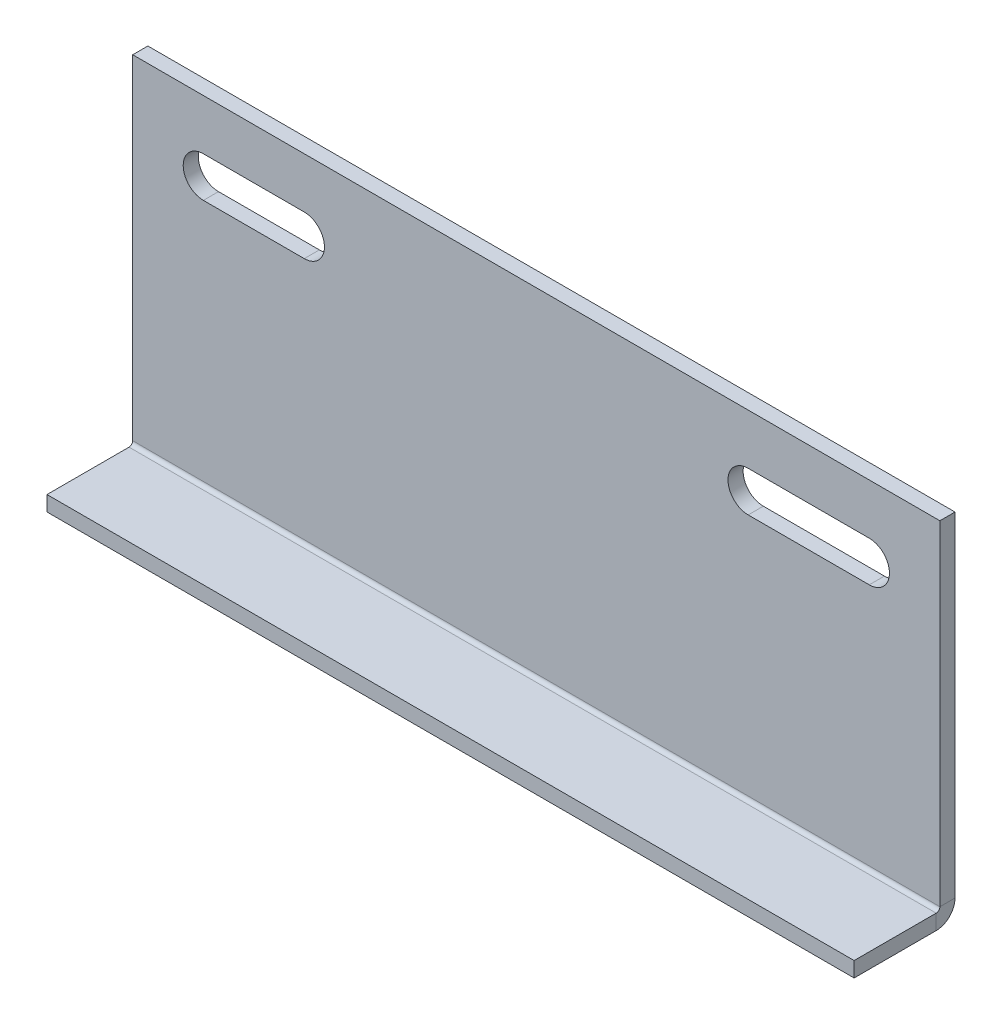
ISO-10303-21;
HEADER;
FILE_DESCRIPTION(('STEP AP214'),'2;1');
FILE_NAME('part.step','',(''),(''),'','','');
FILE_SCHEMA(('AUTOMOTIVE_DESIGN { 1 0 10303 214 1 1 1 1 }'));
ENDSEC;
DATA;
#1=APPLICATION_CONTEXT('core data for automotive mechanical design processes');
#2=APPLICATION_PROTOCOL_DEFINITION('international standard','automotive_design',2000,#1);
#3=PRODUCT_CONTEXT('',#1,'mechanical');
#4=PRODUCT('Part','Part','',(#3));
#5=PRODUCT_RELATED_PRODUCT_CATEGORY('part','',(#4));
#6=PRODUCT_DEFINITION_FORMATION('','',#4);
#7=PRODUCT_DEFINITION_CONTEXT('part definition',#1,'design');
#8=PRODUCT_DEFINITION('design','',#6,#7);
#9=PRODUCT_DEFINITION_SHAPE('','',#8);
#10=(LENGTH_UNIT() NAMED_UNIT(*) SI_UNIT(.MILLI.,.METRE.));
#11=(NAMED_UNIT(*) PLANE_ANGLE_UNIT() SI_UNIT($,.RADIAN.));
#12=(NAMED_UNIT(*) SI_UNIT($,.STERADIAN.) SOLID_ANGLE_UNIT());
#13=UNCERTAINTY_MEASURE_WITH_UNIT(LENGTH_MEASURE(1.E-05),#10,'distance_accuracy_value','');
#14=(GEOMETRIC_REPRESENTATION_CONTEXT(3) GLOBAL_UNCERTAINTY_ASSIGNED_CONTEXT((#13)) GLOBAL_UNIT_ASSIGNED_CONTEXT((#10,
#11,#12)) REPRESENTATION_CONTEXT('',''));
#15=CARTESIAN_POINT('',(0.,0.,0.));
#16=DIRECTION('',(0.,0.,1.));
#17=DIRECTION('',(1.,0.,0.));
#18=AXIS2_PLACEMENT_3D('',#15,#16,#17);
#19=CARTESIAN_POINT('',(1.32994923857861,43.1692047377327,-3.));
#20=DIRECTION('',(1.,0.,0.));
#21=DIRECTION('',(0.,1.,0.));
#22=AXIS2_PLACEMENT_3D('',#19,#20,#21);
#23=PLANE('',#22);
#24=DIRECTION('',(0.,1.,0.));
#25=VECTOR('',#24,1.);
#26=CARTESIAN_POINT('',(1.32994923857861,43.1692047377327,0.));
#27=LINE('',#26,#25);
#28=CARTESIAN_POINT('',(1.32994923857863,-23.0941952622674,0.));
#29=VERTEX_POINT('',#28);
#30=CARTESIAN_POINT('',(1.32994923857861,43.1692047377327,0.));
#31=VERTEX_POINT('',#30);
#32=EDGE_CURVE('E288',#29,#31,#27,.T.);
#33=ORIENTED_EDGE('',*,*,#32,.F.);
#34=DIRECTION('',(0.,0.,-1.));
#35=VECTOR('',#34,1.);
#36=CARTESIAN_POINT('',(1.32994923857863,-23.0941952622674,0.));
#37=LINE('',#36,#35);
#38=CARTESIAN_POINT('',(1.32994923857863,-23.0941952622674,-3.00000000000001));
#39=VERTEX_POINT('',#38);
#40=EDGE_CURVE('E222',#29,#39,#37,.T.);
#41=ORIENTED_EDGE('',*,*,#40,.T.);
#42=DIRECTION('',(0.,1.,0.));
#43=VECTOR('',#42,1.);
#44=CARTESIAN_POINT('',(1.32994923857861,43.1692047377327,-3.));
#45=LINE('',#44,#43);
#46=CARTESIAN_POINT('',(1.32994923857861,43.1692047377327,-3.));
#47=VERTEX_POINT('',#46);
#48=EDGE_CURVE('E295',#39,#47,#45,.T.);
#49=ORIENTED_EDGE('',*,*,#48,.T.);
#50=DIRECTION('',(0.,0.,1.));
#51=VECTOR('',#50,1.);
#52=CARTESIAN_POINT('',(1.32994923857861,43.1692047377327,-3.));
#53=LINE('',#52,#51);
#54=EDGE_CURVE('E61',#47,#31,#53,.T.);
#55=ORIENTED_EDGE('',*,*,#54,.T.);
#56=EDGE_LOOP('',(#33,#41,#49,#55));
#57=FACE_BOUND('',#56,.T.);
#58=ADVANCED_FACE('F58',(#57),#23,.T.);
#59=CARTESIAN_POINT('',(0.,0.,-3.));
#60=DIRECTION('',(0.,0.,-1.));
#61=DIRECTION('',(-1.,0.,0.));
#62=AXIS2_PLACEMENT_3D('',#59,#60,#61);
#63=PLANE('',#62);
#64=CARTESIAN_POINT('',(-12.6700507614214,29.1692047377327,-3.));
#65=DIRECTION('',(0.,0.,1.));
#66=DIRECTION('',(1.,0.,0.));
#67=AXIS2_PLACEMENT_3D('',#64,#65,#66);
#68=CIRCLE('',#67,4.);
#69=CARTESIAN_POINT('',(-12.6700507614214,25.1692047377327,-3.));
#70=VERTEX_POINT('',#69);
#71=CARTESIAN_POINT('',(-12.6700507614214,33.1692047377327,-3.));
#72=VERTEX_POINT('',#71);
#73=EDGE_CURVE('E233',#70,#72,#68,.T.);
#74=ORIENTED_EDGE('',*,*,#73,.T.);
#75=DIRECTION('',(-1.,0.,0.));
#76=VECTOR('',#75,1.);
#77=CARTESIAN_POINT('',(-12.6700507614214,33.1692047377327,-3.));
#78=LINE('',#77,#76);
#79=CARTESIAN_POINT('',(-36.6700507614214,33.1692047377327,-3.));
#80=VERTEX_POINT('',#79);
#81=EDGE_CURVE('E236',#72,#80,#78,.T.);
#82=ORIENTED_EDGE('',*,*,#81,.T.);
#83=CARTESIAN_POINT('',(-36.6700507614214,29.1692047377327,-3.));
#84=DIRECTION('',(0.,0.,1.));
#85=DIRECTION('',(1.,0.,0.));
#86=AXIS2_PLACEMENT_3D('',#83,#84,#85);
#87=CIRCLE('',#86,4.00000000000001);
#88=CARTESIAN_POINT('',(-36.6700507614214,25.1692047377327,-3.));
#89=VERTEX_POINT('',#88);
#90=EDGE_CURVE('E80',#80,#89,#87,.T.);
#91=ORIENTED_EDGE('',*,*,#90,.T.);
#92=DIRECTION('',(1.,0.,0.));
#93=VECTOR('',#92,1.);
#94=CARTESIAN_POINT('',(-12.6700507614214,25.1692047377327,-3.));
#95=LINE('',#94,#93);
#96=EDGE_CURVE('E241',#89,#70,#95,.T.);
#97=ORIENTED_EDGE('',*,*,#96,.T.);
#98=EDGE_LOOP('',(#74,#82,#91,#97));
#99=FACE_BOUND('',#98,.T.);
#100=CARTESIAN_POINT('',(-144.670050761421,29.1692047377327,-3.));
#101=DIRECTION('',(0.,0.,1.));
#102=DIRECTION('',(1.,0.,0.));
#103=AXIS2_PLACEMENT_3D('',#100,#101,#102);
#104=CIRCLE('',#103,4.);
#105=CARTESIAN_POINT('',(-144.670050761421,33.1692047377327,-3.));
#106=VERTEX_POINT('',#105);
#107=CARTESIAN_POINT('',(-144.670050761421,25.1692047377327,-3.));
#108=VERTEX_POINT('',#107);
#109=EDGE_CURVE('E263',#106,#108,#104,.T.);
#110=ORIENTED_EDGE('',*,*,#109,.T.);
#111=DIRECTION('',(1.,0.,0.));
#112=VECTOR('',#111,1.);
#113=CARTESIAN_POINT('',(-144.670050761421,25.1692047377327,-3.));
#114=LINE('',#113,#112);
#115=CARTESIAN_POINT('',(-124.670050761421,25.1692047377327,-3.));
#116=VERTEX_POINT('',#115);
#117=EDGE_CURVE('E266',#108,#116,#114,.T.);
#118=ORIENTED_EDGE('',*,*,#117,.T.);
#119=CARTESIAN_POINT('',(-124.670050761421,29.1692047377327,-3.));
#120=DIRECTION('',(0.,0.,1.));
#121=DIRECTION('',(1.,0.,0.));
#122=AXIS2_PLACEMENT_3D('',#119,#120,#121);
#123=CIRCLE('',#122,4.);
#124=CARTESIAN_POINT('',(-124.670050761421,33.1692047377327,-3.));
#125=VERTEX_POINT('',#124);
#126=EDGE_CURVE('E270',#116,#125,#123,.T.);
#127=ORIENTED_EDGE('',*,*,#126,.T.);
#128=DIRECTION('',(-1.,0.,0.));
#129=VECTOR('',#128,1.);
#130=CARTESIAN_POINT('',(-144.670050761421,33.1692047377327,-3.));
#131=LINE('',#130,#129);
#132=EDGE_CURVE('E273',#125,#106,#131,.T.);
#133=ORIENTED_EDGE('',*,*,#132,.T.);
#134=EDGE_LOOP('',(#110,#118,#127,#133));
#135=FACE_BOUND('',#134,.T.);
#136=ORIENTED_EDGE('',*,*,#48,.F.);
#137=DIRECTION('',(1.,0.,0.));
#138=VECTOR('',#137,1.);
#139=CARTESIAN_POINT('',(1.32994923857863,-23.0941952622674,-3.00000000000001));
#140=LINE('',#139,#138);
#141=CARTESIAN_POINT('',(-158.670050761421,-23.0941952622673,-3.));
#142=VERTEX_POINT('',#141);
#143=EDGE_CURVE('E173',#39,#142,#140,.F.);
#144=ORIENTED_EDGE('',*,*,#143,.T.);
#145=DIRECTION('',(0.,-1.,0.));
#146=VECTOR('',#145,1.);
#147=CARTESIAN_POINT('',(-158.670050761421,43.1692047377326,-3.));
#148=LINE('',#147,#146);
#149=CARTESIAN_POINT('',(-158.670050761421,43.1692047377326,-3.));
#150=VERTEX_POINT('',#149);
#151=EDGE_CURVE('E301',#150,#142,#148,.T.);
#152=ORIENTED_EDGE('',*,*,#151,.F.);
#153=DIRECTION('',(-1.,0.,0.));
#154=VECTOR('',#153,1.);
#155=CARTESIAN_POINT('',(1.32994923857861,43.1692047377327,-3.));
#156=LINE('',#155,#154);
#157=EDGE_CURVE('E297',#47,#150,#156,.T.);
#158=ORIENTED_EDGE('',*,*,#157,.F.);
#159=EDGE_LOOP('',(#136,#144,#152,#158));
#160=FACE_BOUND('',#159,.T.);
#161=ADVANCED_FACE('F324',(#99,#135,#160),#63,.T.);
#162=CARTESIAN_POINT('',(0.,0.,0.));
#163=DIRECTION('',(0.,0.,-1.));
#164=DIRECTION('',(-1.,0.,0.));
#165=AXIS2_PLACEMENT_3D('',#162,#163,#164);
#166=PLANE('',#165);
#167=DIRECTION('',(1.,0.,0.));
#168=VECTOR('',#167,1.);
#169=CARTESIAN_POINT('',(-144.670050761421,25.1692047377327,0.));
#170=LINE('',#169,#168);
#171=CARTESIAN_POINT('',(-144.670050761421,25.1692047377327,0.));
#172=VERTEX_POINT('',#171);
#173=CARTESIAN_POINT('',(-124.670050761421,25.1692047377327,0.));
#174=VERTEX_POINT('',#173);
#175=EDGE_CURVE('E278',#172,#174,#170,.T.);
#176=ORIENTED_EDGE('',*,*,#175,.F.);
#177=CARTESIAN_POINT('',(-144.670050761421,29.1692047377327,0.));
#178=DIRECTION('',(0.,0.,1.));
#179=DIRECTION('',(1.,0.,0.));
#180=AXIS2_PLACEMENT_3D('',#177,#178,#179);
#181=CIRCLE('',#180,4.);
#182=CARTESIAN_POINT('',(-144.670050761421,33.1692047377327,0.));
#183=VERTEX_POINT('',#182);
#184=EDGE_CURVE('E256',#183,#172,#181,.T.);
#185=ORIENTED_EDGE('',*,*,#184,.F.);
#186=DIRECTION('',(-1.,0.,0.));
#187=VECTOR('',#186,1.);
#188=CARTESIAN_POINT('',(-144.670050761421,33.1692047377327,0.));
#189=LINE('',#188,#187);
#190=CARTESIAN_POINT('',(-124.670050761421,33.1692047377327,0.));
#191=VERTEX_POINT('',#190);
#192=EDGE_CURVE('E267',#191,#183,#189,.T.);
#193=ORIENTED_EDGE('',*,*,#192,.F.);
#194=CARTESIAN_POINT('',(-124.670050761421,29.1692047377327,0.));
#195=DIRECTION('',(0.,0.,1.));
#196=DIRECTION('',(1.,0.,0.));
#197=AXIS2_PLACEMENT_3D('',#194,#195,#196);
#198=CIRCLE('',#197,4.);
#199=EDGE_CURVE('E281',#174,#191,#198,.T.);
#200=ORIENTED_EDGE('',*,*,#199,.F.);
#201=EDGE_LOOP('',(#176,#185,#193,#200));
#202=FACE_BOUND('',#201,.T.);
#203=DIRECTION('',(-1.,0.,0.));
#204=VECTOR('',#203,1.);
#205=CARTESIAN_POINT('',(-12.6700507614214,33.1692047377327,0.));
#206=LINE('',#205,#204);
#207=CARTESIAN_POINT('',(-12.6700507614214,33.1692047377327,0.));
#208=VERTEX_POINT('',#207);
#209=CARTESIAN_POINT('',(-36.6700507614214,33.1692047377327,0.));
#210=VERTEX_POINT('',#209);
#211=EDGE_CURVE('E246',#208,#210,#206,.T.);
#212=ORIENTED_EDGE('',*,*,#211,.F.);
#213=CARTESIAN_POINT('',(-12.6700507614214,29.1692047377327,0.));
#214=DIRECTION('',(0.,0.,1.));
#215=DIRECTION('',(1.,0.,0.));
#216=AXIS2_PLACEMENT_3D('',#213,#214,#215);
#217=CIRCLE('',#216,4.);
#218=CARTESIAN_POINT('',(-12.6700507614214,25.1692047377327,0.));
#219=VERTEX_POINT('',#218);
#220=EDGE_CURVE('E231',#219,#208,#217,.T.);
#221=ORIENTED_EDGE('',*,*,#220,.F.);
#222=DIRECTION('',(1.,0.,0.));
#223=VECTOR('',#222,1.);
#224=CARTESIAN_POINT('',(-12.6700507614214,25.1692047377327,0.));
#225=LINE('',#224,#223);
#226=CARTESIAN_POINT('',(-36.6700507614214,25.1692047377327,0.));
#227=VERTEX_POINT('',#226);
#228=EDGE_CURVE('E237',#227,#219,#225,.T.);
#229=ORIENTED_EDGE('',*,*,#228,.F.);
#230=CARTESIAN_POINT('',(-36.6700507614214,29.1692047377327,0.));
#231=DIRECTION('',(0.,0.,1.));
#232=DIRECTION('',(1.,0.,0.));
#233=AXIS2_PLACEMENT_3D('',#230,#231,#232);
#234=CIRCLE('',#233,4.00000000000001);
#235=EDGE_CURVE('E249',#210,#227,#234,.T.);
#236=ORIENTED_EDGE('',*,*,#235,.F.);
#237=EDGE_LOOP('',(#212,#221,#229,#236));
#238=FACE_BOUND('',#237,.T.);
#239=DIRECTION('',(1.,0.,0.));
#240=VECTOR('',#239,1.);
#241=CARTESIAN_POINT('',(1.32994923857863,-23.0941952622674,0.));
#242=LINE('',#241,#240);
#243=CARTESIAN_POINT('',(-158.670050761421,-23.0941952622674,0.));
#244=VERTEX_POINT('',#243);
#245=EDGE_CURVE('E226',#29,#244,#242,.F.);
#246=ORIENTED_EDGE('',*,*,#245,.F.);
#247=ORIENTED_EDGE('',*,*,#32,.T.);
#248=DIRECTION('',(-1.,0.,0.));
#249=VECTOR('',#248,1.);
#250=CARTESIAN_POINT('',(1.32994923857861,43.1692047377327,0.));
#251=LINE('',#250,#249);
#252=CARTESIAN_POINT('',(-158.670050761421,43.1692047377326,0.));
#253=VERTEX_POINT('',#252);
#254=EDGE_CURVE('E305',#31,#253,#251,.T.);
#255=ORIENTED_EDGE('',*,*,#254,.T.);
#256=DIRECTION('',(0.,-1.,0.));
#257=VECTOR('',#256,1.);
#258=CARTESIAN_POINT('',(-158.670050761421,43.1692047377326,0.));
#259=LINE('',#258,#257);
#260=EDGE_CURVE('E298',#253,#244,#259,.T.);
#261=ORIENTED_EDGE('',*,*,#260,.T.);
#262=EDGE_LOOP('',(#246,#247,#255,#261));
#263=FACE_BOUND('',#262,.T.);
#264=ADVANCED_FACE('F313',(#202,#238,#263),#166,.F.);
#265=CARTESIAN_POINT('',(-158.670050761421,43.1692047377326,-3.));
#266=DIRECTION('',(-1.,0.,0.));
#267=DIRECTION('',(0.,0.,1.));
#268=AXIS2_PLACEMENT_3D('',#265,#266,#267);
#269=PLANE('',#268);
#270=DIRECTION('',(0.,0.,-1.));
#271=VECTOR('',#270,1.);
#272=CARTESIAN_POINT('',(-158.670050761421,-23.0941952622674,0.));
#273=LINE('',#272,#271);
#274=EDGE_CURVE('E229',#244,#142,#273,.T.);
#275=ORIENTED_EDGE('',*,*,#274,.F.);
#276=ORIENTED_EDGE('',*,*,#260,.F.);
#277=DIRECTION('',(0.,0.,1.));
#278=VECTOR('',#277,1.);
#279=CARTESIAN_POINT('',(-158.670050761421,43.1692047377326,-3.));
#280=LINE('',#279,#278);
#281=EDGE_CURVE('E13',#150,#253,#280,.T.);
#282=ORIENTED_EDGE('',*,*,#281,.F.);
#283=ORIENTED_EDGE('',*,*,#151,.T.);
#284=EDGE_LOOP('',(#275,#276,#282,#283));
#285=FACE_BOUND('',#284,.T.);
#286=ADVANCED_FACE('F317',(#285),#269,.T.);
#287=CARTESIAN_POINT('',(1.32994923857861,43.1692047377327,-3.));
#288=DIRECTION('',(0.,1.,0.));
#289=DIRECTION('',(-1.,0.,0.));
#290=AXIS2_PLACEMENT_3D('',#287,#288,#289);
#291=PLANE('',#290);
#292=ORIENTED_EDGE('',*,*,#254,.F.);
#293=ORIENTED_EDGE('',*,*,#54,.F.);
#294=ORIENTED_EDGE('',*,*,#157,.T.);
#295=ORIENTED_EDGE('',*,*,#281,.T.);
#296=EDGE_LOOP('',(#292,#293,#294,#295));
#297=FACE_BOUND('',#296,.T.);
#298=ADVANCED_FACE('F330',(#297),#291,.T.);
#299=CARTESIAN_POINT('',(-144.670050761421,29.1692047377327,-3.));
#300=DIRECTION('',(0.,0.,1.));
#301=DIRECTION('',(1.,0.,0.));
#302=AXIS2_PLACEMENT_3D('',#299,#300,#301);
#303=CYLINDRICAL_SURFACE('',#302,4.);
#304=ORIENTED_EDGE('',*,*,#184,.T.);
#305=DIRECTION('',(0.,0.,1.));
#306=VECTOR('',#305,1.);
#307=CARTESIAN_POINT('',(-144.670050761421,25.1692047377327,-3.));
#308=LINE('',#307,#306);
#309=EDGE_CURVE('E276',#108,#172,#308,.T.);
#310=ORIENTED_EDGE('',*,*,#309,.F.);
#311=ORIENTED_EDGE('',*,*,#109,.F.);
#312=DIRECTION('',(0.,0.,1.));
#313=VECTOR('',#312,1.);
#314=CARTESIAN_POINT('',(-144.670050761421,33.1692047377327,-3.));
#315=LINE('',#314,#313);
#316=EDGE_CURVE('E286',#106,#183,#315,.T.);
#317=ORIENTED_EDGE('',*,*,#316,.T.);
#318=EDGE_LOOP('',(#304,#310,#311,#317));
#319=FACE_BOUND('',#318,.T.);
#320=ADVANCED_FACE('F332',(#319),#303,.F.);
#321=CARTESIAN_POINT('',(-144.670050761421,33.1692047377327,-3.));
#322=DIRECTION('',(0.,1.,0.));
#323=DIRECTION('',(-1.,0.,0.));
#324=AXIS2_PLACEMENT_3D('',#321,#322,#323);
#325=PLANE('',#324);
#326=ORIENTED_EDGE('',*,*,#192,.T.);
#327=ORIENTED_EDGE('',*,*,#316,.F.);
#328=ORIENTED_EDGE('',*,*,#132,.F.);
#329=DIRECTION('',(0.,0.,1.));
#330=VECTOR('',#329,1.);
#331=CARTESIAN_POINT('',(-124.670050761421,33.1692047377327,-3.));
#332=LINE('',#331,#330);
#333=EDGE_CURVE('E289',#125,#191,#332,.T.);
#334=ORIENTED_EDGE('',*,*,#333,.T.);
#335=EDGE_LOOP('',(#326,#327,#328,#334));
#336=FACE_BOUND('',#335,.T.);
#337=ADVANCED_FACE('F337',(#336),#325,.F.);
#338=CARTESIAN_POINT('',(-124.670050761421,29.1692047377327,-3.));
#339=DIRECTION('',(0.,0.,1.));
#340=DIRECTION('',(1.,0.,0.));
#341=AXIS2_PLACEMENT_3D('',#338,#339,#340);
#342=CYLINDRICAL_SURFACE('',#341,4.);
#343=ORIENTED_EDGE('',*,*,#199,.T.);
#344=ORIENTED_EDGE('',*,*,#333,.F.);
#345=ORIENTED_EDGE('',*,*,#126,.F.);
#346=DIRECTION('',(0.,0.,1.));
#347=VECTOR('',#346,1.);
#348=CARTESIAN_POINT('',(-124.670050761421,25.1692047377327,-3.));
#349=LINE('',#348,#347);
#350=EDGE_CURVE('E291',#116,#174,#349,.T.);
#351=ORIENTED_EDGE('',*,*,#350,.T.);
#352=EDGE_LOOP('',(#343,#344,#345,#351));
#353=FACE_BOUND('',#352,.T.);
#354=ADVANCED_FACE('F358',(#353),#342,.F.);
#355=CARTESIAN_POINT('',(-144.670050761421,25.1692047377327,-3.));
#356=DIRECTION('',(0.,-1.,0.));
#357=DIRECTION('',(0.,0.,-1.));
#358=AXIS2_PLACEMENT_3D('',#355,#356,#357);
#359=PLANE('',#358);
#360=ORIENTED_EDGE('',*,*,#175,.T.);
#361=ORIENTED_EDGE('',*,*,#350,.F.);
#362=ORIENTED_EDGE('',*,*,#117,.F.);
#363=ORIENTED_EDGE('',*,*,#309,.T.);
#364=EDGE_LOOP('',(#360,#361,#362,#363));
#365=FACE_BOUND('',#364,.T.);
#366=ADVANCED_FACE('F354',(#365),#359,.F.);
#367=CARTESIAN_POINT('',(-12.6700507614214,29.1692047377327,-3.));
#368=DIRECTION('',(0.,0.,1.));
#369=DIRECTION('',(1.,0.,0.));
#370=AXIS2_PLACEMENT_3D('',#367,#368,#369);
#371=CYLINDRICAL_SURFACE('',#370,4.);
#372=ORIENTED_EDGE('',*,*,#220,.T.);
#373=DIRECTION('',(0.,0.,1.));
#374=VECTOR('',#373,1.);
#375=CARTESIAN_POINT('',(-12.6700507614214,33.1692047377327,-3.));
#376=LINE('',#375,#374);
#377=EDGE_CURVE('E244',#72,#208,#376,.T.);
#378=ORIENTED_EDGE('',*,*,#377,.F.);
#379=ORIENTED_EDGE('',*,*,#73,.F.);
#380=DIRECTION('',(0.,0.,1.));
#381=VECTOR('',#380,1.);
#382=CARTESIAN_POINT('',(-12.6700507614214,25.1692047377327,-3.));
#383=LINE('',#382,#381);
#384=EDGE_CURVE('E254',#70,#219,#383,.T.);
#385=ORIENTED_EDGE('',*,*,#384,.T.);
#386=EDGE_LOOP('',(#372,#378,#379,#385));
#387=FACE_BOUND('',#386,.T.);
#388=ADVANCED_FACE('F357',(#387),#371,.F.);
#389=CARTESIAN_POINT('',(-12.6700507614214,25.1692047377327,-3.));
#390=DIRECTION('',(0.,-1.,0.));
#391=DIRECTION('',(1.,0.,0.));
#392=AXIS2_PLACEMENT_3D('',#389,#390,#391);
#393=PLANE('',#392);
#394=ORIENTED_EDGE('',*,*,#228,.T.);
#395=ORIENTED_EDGE('',*,*,#384,.F.);
#396=ORIENTED_EDGE('',*,*,#96,.F.);
#397=DIRECTION('',(0.,0.,1.));
#398=VECTOR('',#397,1.);
#399=CARTESIAN_POINT('',(-36.6700507614214,25.1692047377327,-3.));
#400=LINE('',#399,#398);
#401=EDGE_CURVE('E257',#89,#227,#400,.T.);
#402=ORIENTED_EDGE('',*,*,#401,.T.);
#403=EDGE_LOOP('',(#394,#395,#396,#402));
#404=FACE_BOUND('',#403,.T.);
#405=ADVANCED_FACE('F368',(#404),#393,.F.);
#406=CARTESIAN_POINT('',(-36.6700507614214,29.1692047377327,-3.));
#407=DIRECTION('',(0.,0.,1.));
#408=DIRECTION('',(1.,0.,0.));
#409=AXIS2_PLACEMENT_3D('',#406,#407,#408);
#410=CYLINDRICAL_SURFACE('',#409,4.00000000000001);
#411=ORIENTED_EDGE('',*,*,#235,.T.);
#412=ORIENTED_EDGE('',*,*,#401,.F.);
#413=ORIENTED_EDGE('',*,*,#90,.F.);
#414=DIRECTION('',(0.,0.,1.));
#415=VECTOR('',#414,1.);
#416=CARTESIAN_POINT('',(-36.6700507614214,33.1692047377327,-3.));
#417=LINE('',#416,#415);
#418=EDGE_CURVE('E259',#80,#210,#417,.T.);
#419=ORIENTED_EDGE('',*,*,#418,.T.);
#420=EDGE_LOOP('',(#411,#412,#413,#419));
#421=FACE_BOUND('',#420,.T.);
#422=ADVANCED_FACE('F373',(#421),#410,.F.);
#423=CARTESIAN_POINT('',(-12.6700507614214,33.1692047377327,-3.));
#424=DIRECTION('',(0.,1.,0.));
#425=DIRECTION('',(-1.,0.,0.));
#426=AXIS2_PLACEMENT_3D('',#423,#424,#425);
#427=PLANE('',#426);
#428=ORIENTED_EDGE('',*,*,#211,.T.);
#429=ORIENTED_EDGE('',*,*,#418,.F.);
#430=ORIENTED_EDGE('',*,*,#81,.F.);
#431=ORIENTED_EDGE('',*,*,#377,.T.);
#432=EDGE_LOOP('',(#428,#429,#430,#431));
#433=FACE_BOUND('',#432,.T.);
#434=ADVANCED_FACE('F370',(#433),#427,.F.);
#435=CARTESIAN_POINT('',(-158.670050761421,-23.0941952622674,0.736600000000002));
#436=DIRECTION('',(-1.,0.,0.));
#437=DIRECTION('',(0.,0.,1.));
#438=AXIS2_PLACEMENT_3D('',#435,#436,#437);
#439=PLANE('',#438);
#440=DIRECTION('',(0.,-1.,0.));
#441=VECTOR('',#440,1.);
#442=CARTESIAN_POINT('',(-158.670050761421,-26.8307952622674,0.736599999999987));
#443=LINE('',#442,#441);
#444=CARTESIAN_POINT('',(-158.670050761421,-23.8307952622674,0.736599999999999));
#445=VERTEX_POINT('',#444);
#446=CARTESIAN_POINT('',(-158.670050761421,-26.8307952622674,0.736599999999989));
#447=VERTEX_POINT('',#446);
#448=EDGE_CURVE('E218',#445,#447,#443,.T.);
#449=ORIENTED_EDGE('',*,*,#448,.F.);
#450=CARTESIAN_POINT('',(-158.670050761421,-23.0941952622674,0.736600000000002));
#451=DIRECTION('',(1.,0.,0.));
#452=DIRECTION('',(0.,0.,-1.));
#453=AXIS2_PLACEMENT_3D('',#450,#451,#452);
#454=CIRCLE('',#453,0.736600000000004);
#455=EDGE_CURVE('E176',#244,#445,#454,.F.);
#456=ORIENTED_EDGE('',*,*,#455,.F.);
#457=ORIENTED_EDGE('',*,*,#274,.T.);
#458=CARTESIAN_POINT('',(-158.670050761421,-23.0941952622674,0.736600000000002));
#459=DIRECTION('',(1.,0.,0.));
#460=DIRECTION('',(0.,0.,-1.));
#461=AXIS2_PLACEMENT_3D('',#458,#459,#460);
#462=CIRCLE('',#461,3.7366);
#463=EDGE_CURVE('E72',#142,#447,#462,.F.);
#464=ORIENTED_EDGE('',*,*,#463,.T.);
#465=EDGE_LOOP('',(#449,#456,#457,#464));
#466=FACE_BOUND('',#465,.T.);
#467=ADVANCED_FACE('F321',(#466),#439,.T.);
#468=CARTESIAN_POINT('',(1.32994923857863,-23.0941952622674,0.73659999999999));
#469=DIRECTION('',(-1.,0.,0.));
#470=DIRECTION('',(0.,0.,1.));
#471=AXIS2_PLACEMENT_3D('',#468,#469,#470);
#472=PLANE('',#471);
#473=CARTESIAN_POINT('',(1.32994923857863,-23.0941952622674,0.73659999999999));
#474=DIRECTION('',(1.,0.,0.));
#475=DIRECTION('',(0.,0.,-1.));
#476=AXIS2_PLACEMENT_3D('',#473,#474,#475);
#477=CIRCLE('',#476,0.736600000000004);
#478=CARTESIAN_POINT('',(1.32994923857863,-23.8307952622674,0.736599999999988));
#479=VERTEX_POINT('',#478);
#480=EDGE_CURVE('E183',#479,#29,#477,.T.);
#481=ORIENTED_EDGE('',*,*,#480,.F.);
#482=DIRECTION('',(0.,-1.,0.));
#483=VECTOR('',#482,1.);
#484=CARTESIAN_POINT('',(1.32994923857863,-23.8307952622674,0.73659999999999));
#485=LINE('',#484,#483);
#486=CARTESIAN_POINT('',(1.32994923857863,-26.8307952622674,0.736599999999979));
#487=VERTEX_POINT('',#486);
#488=EDGE_CURVE('E180',#479,#487,#485,.T.);
#489=ORIENTED_EDGE('',*,*,#488,.T.);
#490=CARTESIAN_POINT('',(1.32994923857863,-23.0941952622674,0.73659999999999));
#491=DIRECTION('',(1.,0.,0.));
#492=DIRECTION('',(0.,0.,-1.));
#493=AXIS2_PLACEMENT_3D('',#490,#491,#492);
#494=CIRCLE('',#493,3.7366);
#495=EDGE_CURVE('E167',#487,#39,#494,.T.);
#496=ORIENTED_EDGE('',*,*,#495,.T.);
#497=ORIENTED_EDGE('',*,*,#40,.F.);
#498=EDGE_LOOP('',(#481,#489,#496,#497));
#499=FACE_BOUND('',#498,.T.);
#500=ADVANCED_FACE('F181',(#499),#472,.F.);
#501=CARTESIAN_POINT('',(1.32994923857863,-23.0941952622674,0.73659999999999));
#502=DIRECTION('',(1.,0.,0.));
#503=DIRECTION('',(0.,-1.,0.));
#504=AXIS2_PLACEMENT_3D('',#501,#502,#503);
#505=CYLINDRICAL_SURFACE('',#504,3.7366);
#506=ORIENTED_EDGE('',*,*,#143,.F.);
#507=ORIENTED_EDGE('',*,*,#495,.F.);
#508=DIRECTION('',(1.,0.,0.));
#509=VECTOR('',#508,1.);
#510=CARTESIAN_POINT('',(0.,-26.8307952622674,0.73659999999998));
#511=LINE('',#510,#509);
#512=EDGE_CURVE('E171',#447,#487,#511,.T.);
#513=ORIENTED_EDGE('',*,*,#512,.F.);
#514=ORIENTED_EDGE('',*,*,#463,.F.);
#515=EDGE_LOOP('',(#506,#507,#513,#514));
#516=FACE_BOUND('',#515,.T.);
#517=ADVANCED_FACE('F169',(#516),#505,.T.);
#518=CARTESIAN_POINT('',(1.32994923857863,-23.0941952622674,0.73659999999999));
#519=DIRECTION('',(1.,0.,0.));
#520=DIRECTION('',(0.,-1.,0.));
#521=AXIS2_PLACEMENT_3D('',#518,#519,#520);
#522=CYLINDRICAL_SURFACE('',#521,0.736600000000004);
#523=ORIENTED_EDGE('',*,*,#245,.T.);
#524=ORIENTED_EDGE('',*,*,#455,.T.);
#525=DIRECTION('',(-1.,0.,0.));
#526=VECTOR('',#525,1.);
#527=CARTESIAN_POINT('',(-158.670050761421,-23.8307952622674,0.736599999999997));
#528=LINE('',#527,#526);
#529=EDGE_CURVE('E188',#445,#479,#528,.F.);
#530=ORIENTED_EDGE('',*,*,#529,.T.);
#531=ORIENTED_EDGE('',*,*,#480,.T.);
#532=EDGE_LOOP('',(#523,#524,#530,#531));
#533=FACE_BOUND('',#532,.T.);
#534=ADVANCED_FACE('F384',(#533),#522,.F.);
#535=CARTESIAN_POINT('',(1.32994923857863,-26.8307952622674,0.));
#536=DIRECTION('',(1.,0.,0.));
#537=DIRECTION('',(0.,1.,0.));
#538=AXIS2_PLACEMENT_3D('',#535,#536,#537);
#539=PLANE('',#538);
#540=DIRECTION('',(0.,0.,-1.));
#541=VECTOR('',#540,1.);
#542=CARTESIAN_POINT('',(1.32994923857863,-26.8307952622674,0.));
#543=LINE('',#542,#541);
#544=CARTESIAN_POINT('',(1.32994923857863,-26.8307952622674,17.));
#545=VERTEX_POINT('',#544);
#546=EDGE_CURVE('E195',#545,#487,#543,.T.);
#547=ORIENTED_EDGE('',*,*,#546,.T.);
#548=ORIENTED_EDGE('',*,*,#488,.F.);
#549=DIRECTION('',(0.,0.,1.));
#550=VECTOR('',#549,1.);
#551=CARTESIAN_POINT('',(1.32994923857863,-23.8307952622674,0.));
#552=LINE('',#551,#550);
#553=CARTESIAN_POINT('',(1.32994923857863,-23.8307952622674,17.));
#554=VERTEX_POINT('',#553);
#555=EDGE_CURVE('E211',#554,#479,#552,.F.);
#556=ORIENTED_EDGE('',*,*,#555,.F.);
#557=DIRECTION('',(0.,1.,0.));
#558=VECTOR('',#557,1.);
#559=CARTESIAN_POINT('',(1.32994923857863,-26.8307952622674,17.));
#560=LINE('',#559,#558);
#561=EDGE_CURVE('E200',#545,#554,#560,.T.);
#562=ORIENTED_EDGE('',*,*,#561,.F.);
#563=EDGE_LOOP('',(#547,#548,#556,#562));
#564=FACE_BOUND('',#563,.T.);
#565=ADVANCED_FACE('F199',(#564),#539,.T.);
#566=CARTESIAN_POINT('',(-158.670050761421,-26.8307952622674,17.));
#567=DIRECTION('',(-1.,0.,0.));
#568=DIRECTION('',(0.,-1.,0.));
#569=AXIS2_PLACEMENT_3D('',#566,#567,#568);
#570=PLANE('',#569);
#571=DIRECTION('',(0.,0.,-1.));
#572=VECTOR('',#571,1.);
#573=CARTESIAN_POINT('',(-158.670050761421,-23.8307952622674,0.));
#574=LINE('',#573,#572);
#575=CARTESIAN_POINT('',(-158.670050761421,-23.8307952622674,17.));
#576=VERTEX_POINT('',#575);
#577=EDGE_CURVE('E197',#445,#576,#574,.F.);
#578=ORIENTED_EDGE('',*,*,#577,.F.);
#579=ORIENTED_EDGE('',*,*,#448,.T.);
#580=DIRECTION('',(0.,0.,1.));
#581=VECTOR('',#580,1.);
#582=CARTESIAN_POINT('',(-158.670050761421,-26.8307952622674,17.));
#583=LINE('',#582,#581);
#584=CARTESIAN_POINT('',(-158.670050761421,-26.8307952622674,17.));
#585=VERTEX_POINT('',#584);
#586=EDGE_CURVE('E196',#447,#585,#583,.T.);
#587=ORIENTED_EDGE('',*,*,#586,.T.);
#588=DIRECTION('',(0.,1.,0.));
#589=VECTOR('',#588,1.);
#590=CARTESIAN_POINT('',(-158.670050761421,-26.8307952622674,17.));
#591=LINE('',#590,#589);
#592=EDGE_CURVE('E202',#585,#576,#591,.T.);
#593=ORIENTED_EDGE('',*,*,#592,.T.);
#594=EDGE_LOOP('',(#578,#579,#587,#593));
#595=FACE_BOUND('',#594,.T.);
#596=ADVANCED_FACE('F390',(#595),#570,.T.);
#597=CARTESIAN_POINT('',(0.,-26.8307952622674,-1.03562464857694E-13));
#598=DIRECTION('',(0.,-1.,0.));
#599=DIRECTION('',(0.,0.,-1.));
#600=AXIS2_PLACEMENT_3D('',#597,#598,#599);
#601=PLANE('',#600);
#602=ORIENTED_EDGE('',*,*,#586,.F.);
#603=ORIENTED_EDGE('',*,*,#512,.T.);
#604=ORIENTED_EDGE('',*,*,#546,.F.);
#605=DIRECTION('',(1.,0.,0.));
#606=VECTOR('',#605,1.);
#607=CARTESIAN_POINT('',(1.32994923857863,-26.8307952622674,17.));
#608=LINE('',#607,#606);
#609=EDGE_CURVE('E203',#585,#545,#608,.T.);
#610=ORIENTED_EDGE('',*,*,#609,.F.);
#611=EDGE_LOOP('',(#602,#603,#604,#610));
#612=FACE_BOUND('',#611,.T.);
#613=ADVANCED_FACE('F193',(#612),#601,.T.);
#614=CARTESIAN_POINT('',(0.,-23.8307952622674,0.));
#615=DIRECTION('',(0.,-1.,0.));
#616=DIRECTION('',(0.,0.,-1.));
#617=AXIS2_PLACEMENT_3D('',#614,#615,#616);
#618=PLANE('',#617);
#619=ORIENTED_EDGE('',*,*,#529,.F.);
#620=ORIENTED_EDGE('',*,*,#577,.T.);
#621=DIRECTION('',(-1.,0.,0.));
#622=VECTOR('',#621,1.);
#623=CARTESIAN_POINT('',(0.,-23.8307952622674,17.));
#624=LINE('',#623,#622);
#625=EDGE_CURVE('E213',#576,#554,#624,.F.);
#626=ORIENTED_EDGE('',*,*,#625,.T.);
#627=ORIENTED_EDGE('',*,*,#555,.T.);
#628=EDGE_LOOP('',(#619,#620,#626,#627));
#629=FACE_BOUND('',#628,.T.);
#630=ADVANCED_FACE('F397',(#629),#618,.F.);
#631=CARTESIAN_POINT('',(1.32994923857863,-26.8307952622674,17.));
#632=DIRECTION('',(0.,0.,1.));
#633=DIRECTION('',(0.,-1.,0.));
#634=AXIS2_PLACEMENT_3D('',#631,#632,#633);
#635=PLANE('',#634);
#636=ORIENTED_EDGE('',*,*,#625,.F.);
#637=ORIENTED_EDGE('',*,*,#592,.F.);
#638=ORIENTED_EDGE('',*,*,#609,.T.);
#639=ORIENTED_EDGE('',*,*,#561,.T.);
#640=EDGE_LOOP('',(#636,#637,#638,#639));
#641=FACE_BOUND('',#640,.T.);
#642=ADVANCED_FACE('F394',(#641),#635,.T.);
#643=CLOSED_SHELL('',(#58,#161,#264,#286,#298,#320,#337,#354,#366,#388,#405,#422,#434,#467,#500,
#517,#534,#565,#596,#613,#630,#642));
#644=MANIFOLD_SOLID_BREP('B2',#643);
#645=ADVANCED_BREP_SHAPE_REPRESENTATION('',(#18,#644),#14);
#646=SHAPE_DEFINITION_REPRESENTATION(#9,#645);
ENDSEC;
END-ISO-10303-21;
